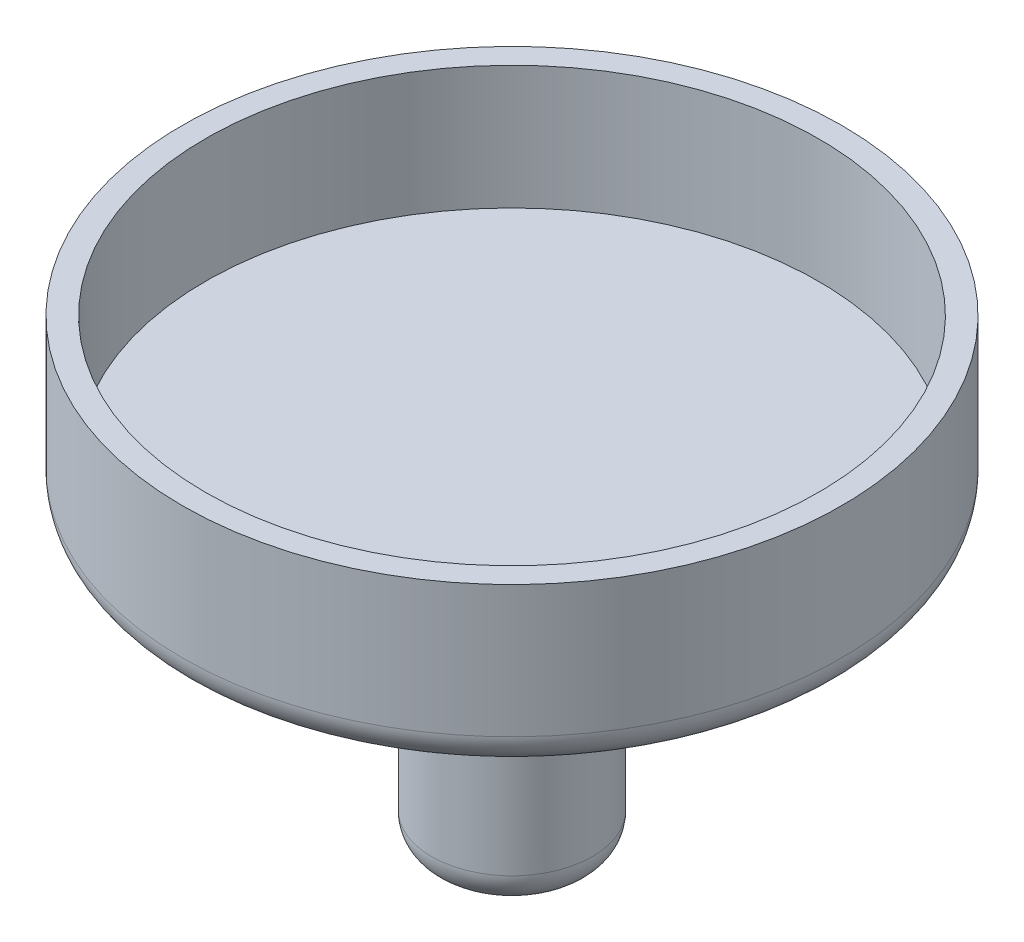
ISO-10303-21;
HEADER;
FILE_DESCRIPTION(('STEP AP214'),'2;1');
FILE_NAME('part.step','',(''),(''),'','','');
FILE_SCHEMA(('AUTOMOTIVE_DESIGN { 1 0 10303 214 1 1 1 1 }'));
ENDSEC;
DATA;
#1=APPLICATION_CONTEXT('core data for automotive mechanical design processes');
#2=APPLICATION_PROTOCOL_DEFINITION('international standard','automotive_design',2000,#1);
#3=PRODUCT_CONTEXT('',#1,'mechanical');
#4=PRODUCT('Part','Part','',(#3));
#5=PRODUCT_RELATED_PRODUCT_CATEGORY('part','',(#4));
#6=PRODUCT_DEFINITION_FORMATION('','',#4);
#7=PRODUCT_DEFINITION_CONTEXT('part definition',#1,'design');
#8=PRODUCT_DEFINITION('design','',#6,#7);
#9=PRODUCT_DEFINITION_SHAPE('','',#8);
#10=(LENGTH_UNIT() NAMED_UNIT(*) SI_UNIT(.MILLI.,.METRE.));
#11=(NAMED_UNIT(*) PLANE_ANGLE_UNIT() SI_UNIT($,.RADIAN.));
#12=(NAMED_UNIT(*) SI_UNIT($,.STERADIAN.) SOLID_ANGLE_UNIT());
#13=UNCERTAINTY_MEASURE_WITH_UNIT(LENGTH_MEASURE(1.E-05),#10,'distance_accuracy_value','');
#14=(GEOMETRIC_REPRESENTATION_CONTEXT(3) GLOBAL_UNCERTAINTY_ASSIGNED_CONTEXT((#13)) GLOBAL_UNIT_ASSIGNED_CONTEXT((#10,
#11,#12)) REPRESENTATION_CONTEXT('',''));
#15=CARTESIAN_POINT('',(0.,0.,0.));
#16=DIRECTION('',(0.,0.,1.));
#17=DIRECTION('',(1.,0.,0.));
#18=AXIS2_PLACEMENT_3D('',#15,#16,#17);
#19=CARTESIAN_POINT('',(0.,6.35,0.));
#20=DIRECTION('',(0.,-1.,0.));
#21=DIRECTION('',(0.,0.,-1.));
#22=AXIS2_PLACEMENT_3D('',#19,#20,#21);
#23=CYLINDRICAL_SURFACE('',#22,12.7);
#24=CARTESIAN_POINT('',(0.,1.27,0.));
#25=DIRECTION('',(0.,1.,0.));
#26=DIRECTION('',(0.,0.,1.));
#27=AXIS2_PLACEMENT_3D('',#24,#25,#26);
#28=CIRCLE('',#27,12.7);
#29=CARTESIAN_POINT('',(0.,1.27,12.7));
#30=VERTEX_POINT('',#29);
#31=EDGE_CURVE('E65',#30,#30,#28,.T.);
#32=ORIENTED_EDGE('',*,*,#31,.T.);
#33=EDGE_LOOP('',(#32));
#34=FACE_BOUND('',#33,.T.);
#35=CARTESIAN_POINT('',(0.,6.35,0.));
#36=DIRECTION('',(0.,1.,0.));
#37=DIRECTION('',(0.,0.,1.));
#38=AXIS2_PLACEMENT_3D('',#35,#36,#37);
#39=CIRCLE('',#38,12.7);
#40=CARTESIAN_POINT('',(0.,6.35,12.7));
#41=VERTEX_POINT('',#40);
#42=EDGE_CURVE('E69',#41,#41,#39,.T.);
#43=ORIENTED_EDGE('',*,*,#42,.F.);
#44=EDGE_LOOP('',(#43));
#45=FACE_BOUND('',#44,.T.);
#46=ADVANCED_FACE('F37',(#34,#45),#23,.T.);
#47=CARTESIAN_POINT('',(0.,6.35,0.));
#48=DIRECTION('',(0.,1.,0.));
#49=DIRECTION('',(0.,0.,1.));
#50=AXIS2_PLACEMENT_3D('',#47,#48,#49);
#51=PLANE('',#50);
#52=CARTESIAN_POINT('',(0.,6.35,0.));
#53=DIRECTION('',(0.,1.,0.));
#54=DIRECTION('',(0.,0.,1.));
#55=AXIS2_PLACEMENT_3D('',#52,#53,#54);
#56=CIRCLE('',#55,11.811);
#57=CARTESIAN_POINT('',(0.,6.35,11.811));
#58=VERTEX_POINT('',#57);
#59=EDGE_CURVE('E74',#58,#58,#56,.T.);
#60=ORIENTED_EDGE('',*,*,#59,.F.);
#61=EDGE_LOOP('',(#60));
#62=FACE_BOUND('',#61,.T.);
#63=ORIENTED_EDGE('',*,*,#42,.T.);
#64=EDGE_LOOP('',(#63));
#65=FACE_BOUND('',#64,.T.);
#66=ADVANCED_FACE('F91',(#62,#65),#51,.T.);
#67=CARTESIAN_POINT('',(0.,0.,0.));
#68=DIRECTION('',(0.,1.,0.));
#69=DIRECTION('',(0.,0.,1.));
#70=AXIS2_PLACEMENT_3D('',#67,#68,#69);
#71=PLANE('',#70);
#72=CARTESIAN_POINT('',(0.,0.,0.));
#73=DIRECTION('',(0.,1.,0.));
#74=DIRECTION('',(0.,0.,1.));
#75=AXIS2_PLACEMENT_3D('',#72,#73,#74);
#76=CIRCLE('',#75,11.43);
#77=CARTESIAN_POINT('',(0.,0.,11.43));
#78=VERTEX_POINT('',#77);
#79=EDGE_CURVE('E55',#78,#78,#76,.F.);
#80=ORIENTED_EDGE('',*,*,#79,.T.);
#81=EDGE_LOOP('',(#80));
#82=FACE_BOUND('',#81,.T.);
#83=CARTESIAN_POINT('',(0.,0.,0.));
#84=DIRECTION('',(0.,1.,0.));
#85=DIRECTION('',(0.,0.,1.));
#86=AXIS2_PLACEMENT_3D('',#83,#84,#85);
#87=CIRCLE('',#86,4.3688);
#88=CARTESIAN_POINT('',(0.,0.,4.3688));
#89=VERTEX_POINT('',#88);
#90=EDGE_CURVE('E61',#89,#89,#87,.T.);
#91=ORIENTED_EDGE('',*,*,#90,.T.);
#92=EDGE_LOOP('',(#91));
#93=FACE_BOUND('',#92,.T.);
#94=ADVANCED_FACE('F87',(#82,#93),#71,.F.);
#95=CARTESIAN_POINT('',(0.,1.5875,0.));
#96=DIRECTION('',(0.,1.,0.));
#97=DIRECTION('',(0.,0.,1.));
#98=AXIS2_PLACEMENT_3D('',#95,#96,#97);
#99=CYLINDRICAL_SURFACE('',#98,11.811);
#100=CARTESIAN_POINT('',(0.,1.5875,0.));
#101=DIRECTION('',(0.,1.,0.));
#102=DIRECTION('',(0.,0.,1.));
#103=AXIS2_PLACEMENT_3D('',#100,#101,#102);
#104=CIRCLE('',#103,11.811);
#105=CARTESIAN_POINT('',(0.,1.5875,11.811));
#106=VERTEX_POINT('',#105);
#107=EDGE_CURVE('E73',#106,#106,#104,.T.);
#108=CARTESIAN_POINT('',(0.,1.5875,11.811));
#109=CARTESIAN_POINT('',(0.,1.637109375,11.811));
#110=CARTESIAN_POINT('',(0.,1.68671875,11.811));
#111=CARTESIAN_POINT('',(0.,1.7859375,11.811));
#112=CARTESIAN_POINT('',(0.,1.835546875,11.811));
#113=CARTESIAN_POINT('',(0.,1.934765625,11.811));
#114=CARTESIAN_POINT('',(0.,1.984375,11.811));
#115=CARTESIAN_POINT('',(0.,2.08359375,11.811));
#116=CARTESIAN_POINT('',(0.,2.133203125,11.811));
#117=CARTESIAN_POINT('',(0.,2.232421875,11.811));
#118=CARTESIAN_POINT('',(0.,2.28203125,11.811));
#119=CARTESIAN_POINT('',(0.,2.38125,11.811));
#120=CARTESIAN_POINT('',(0.,2.430859375,11.811));
#121=CARTESIAN_POINT('',(0.,2.530078125,11.811));
#122=CARTESIAN_POINT('',(0.,2.5796875,11.811));
#123=CARTESIAN_POINT('',(0.,2.67890625,11.811));
#124=CARTESIAN_POINT('',(0.,2.728515625,11.811));
#125=CARTESIAN_POINT('',(0.,2.827734375,11.811));
#126=CARTESIAN_POINT('',(0.,2.87734375,11.811));
#127=CARTESIAN_POINT('',(0.,2.9765625,11.811));
#128=CARTESIAN_POINT('',(0.,3.026171875,11.811));
#129=CARTESIAN_POINT('',(0.,3.125390625,11.811));
#130=CARTESIAN_POINT('',(0.,3.175,11.811));
#131=CARTESIAN_POINT('',(0.,3.27421875,11.811));
#132=CARTESIAN_POINT('',(0.,3.323828125,11.811));
#133=CARTESIAN_POINT('',(0.,3.423046875,11.811));
#134=CARTESIAN_POINT('',(0.,3.47265625,11.811));
#135=CARTESIAN_POINT('',(0.,3.571875,11.811));
#136=CARTESIAN_POINT('',(0.,3.621484375,11.811));
#137=CARTESIAN_POINT('',(0.,3.720703125,11.811));
#138=CARTESIAN_POINT('',(0.,3.7703125,11.811));
#139=CARTESIAN_POINT('',(0.,3.86953125,11.811));
#140=CARTESIAN_POINT('',(0.,3.919140625,11.811));
#141=CARTESIAN_POINT('',(0.,4.018359375,11.811));
#142=CARTESIAN_POINT('',(0.,4.06796875,11.811));
#143=CARTESIAN_POINT('',(0.,4.1671875,11.811));
#144=CARTESIAN_POINT('',(0.,4.216796875,11.811));
#145=CARTESIAN_POINT('',(0.,4.316015625,11.811));
#146=CARTESIAN_POINT('',(0.,4.365625,11.811));
#147=CARTESIAN_POINT('',(0.,4.46484375,11.811));
#148=CARTESIAN_POINT('',(0.,4.514453125,11.811));
#149=CARTESIAN_POINT('',(0.,4.613671875,11.811));
#150=CARTESIAN_POINT('',(0.,4.66328125,11.811));
#151=CARTESIAN_POINT('',(0.,4.7625,11.811));
#152=CARTESIAN_POINT('',(0.,4.812109375,11.811));
#153=CARTESIAN_POINT('',(0.,4.911328125,11.811));
#154=CARTESIAN_POINT('',(0.,4.9609375,11.811));
#155=CARTESIAN_POINT('',(0.,5.06015625,11.811));
#156=CARTESIAN_POINT('',(0.,5.109765625,11.811));
#157=CARTESIAN_POINT('',(0.,5.208984375,11.811));
#158=CARTESIAN_POINT('',(0.,5.25859375,11.811));
#159=CARTESIAN_POINT('',(0.,5.3578125,11.811));
#160=CARTESIAN_POINT('',(0.,5.407421875,11.811));
#161=CARTESIAN_POINT('',(0.,5.506640625,11.811));
#162=CARTESIAN_POINT('',(0.,5.55625,11.811));
#163=CARTESIAN_POINT('',(0.,5.65546875,11.811));
#164=CARTESIAN_POINT('',(0.,5.705078125,11.811));
#165=CARTESIAN_POINT('',(0.,5.804296875,11.811));
#166=CARTESIAN_POINT('',(0.,5.85390625,11.811));
#167=CARTESIAN_POINT('',(0.,5.953125,11.811));
#168=CARTESIAN_POINT('',(0.,6.002734375,11.811));
#169=CARTESIAN_POINT('',(0.,6.101953125,11.811));
#170=CARTESIAN_POINT('',(0.,6.1515625,11.811));
#171=CARTESIAN_POINT('',(0.,6.25078125,11.811));
#172=CARTESIAN_POINT('',(0.,6.300390625,11.811));
#173=CARTESIAN_POINT('',(0.,6.35,11.811));
#174=B_SPLINE_CURVE_WITH_KNOTS('',3,(#108,#109,#110,#111,#112,#113,#114,#115,#116,#117,#118,
#119,#120,#121,#122,#123,#124,#125,#126,#127,#128,#129,#130,#131,#132,#133,#134,#135,#136,#137,
#138,#139,#140,#141,#142,#143,#144,#145,#146,#147,#148,#149,#150,#151,#152,#153,#154,#155,#156,
#157,#158,#159,#160,#161,#162,#163,#164,#165,#166,#167,#168,#169,#170,#171,#172,#173),
.UNSPECIFIED.,.F.,.F.,(4,2,2,2,2,2,2,2,2,2,2,2,2,2,2,2,2,2,2,2,2,2,2,2,2,2,2,2,2,2,2,2,4),(0.,
0.148828125,0.29765625,0.446484375,0.5953125,0.744140625,0.89296875,1.041796875,1.190625,
1.339453125,1.48828125,1.637109375,1.7859375,1.934765625,2.08359375,2.232421875,2.38125,
2.530078125,2.67890625,2.827734375,2.9765625,3.125390625,3.27421875,3.423046875,3.571875,
3.720703125,3.86953125,4.018359375,4.1671875,4.316015625,4.46484375,4.613671875,4.7625),.UNSPECIFIED.);
#175=EDGE_CURVE('BSEAM84',#106,#58,#174,.T.);
#176=ORIENTED_EDGE('',*,*,#107,.F.);
#177=ORIENTED_EDGE('',*,*,#59,.T.);
#178=ORIENTED_EDGE('',*,*,#175,.T.);
#179=ORIENTED_EDGE('',*,*,#175,.F.);
#180=EDGE_LOOP('',(#176,#178,#177,#179));
#181=FACE_BOUND('',#180,.T.);
#182=ADVANCED_FACE('F84',(#181),#99,.F.);
#183=CARTESIAN_POINT('',(0.,1.5875,0.));
#184=DIRECTION('',(0.,1.,0.));
#185=DIRECTION('',(0.,0.,1.));
#186=AXIS2_PLACEMENT_3D('',#183,#184,#185);
#187=PLANE('',#186);
#188=ORIENTED_EDGE('',*,*,#107,.T.);
#189=EDGE_LOOP('',(#188));
#190=FACE_BOUND('',#189,.T.);
#191=ADVANCED_FACE('F82',(#190),#187,.T.);
#192=CARTESIAN_POINT('',(0.,-11.43,0.));
#193=DIRECTION('',(0.,1.,0.));
#194=DIRECTION('',(0.,0.,1.));
#195=AXIS2_PLACEMENT_3D('',#192,#193,#194);
#196=CYLINDRICAL_SURFACE('',#195,3.0988);
#197=CARTESIAN_POINT('',(0.,-1.27,0.));
#198=DIRECTION('',(0.,1.,0.));
#199=DIRECTION('',(0.,0.,1.));
#200=AXIS2_PLACEMENT_3D('',#197,#198,#199);
#201=CIRCLE('',#200,3.0988);
#202=CARTESIAN_POINT('',(0.,-1.27,3.0988));
#203=VERTEX_POINT('',#202);
#204=EDGE_CURVE('E45',#203,#203,#201,.F.);
#205=ORIENTED_EDGE('',*,*,#204,.T.);
#206=EDGE_LOOP('',(#205));
#207=FACE_BOUND('',#206,.T.);
#208=CARTESIAN_POINT('',(0.,-10.16,0.));
#209=DIRECTION('',(0.,-1.,0.));
#210=DIRECTION('',(0.,0.,-1.));
#211=AXIS2_PLACEMENT_3D('',#208,#209,#210);
#212=CIRCLE('',#211,3.0988);
#213=CARTESIAN_POINT('',(0.,-10.16,-3.0988));
#214=VERTEX_POINT('',#213);
#215=EDGE_CURVE('E50',#214,#214,#212,.F.);
#216=ORIENTED_EDGE('',*,*,#215,.T.);
#217=EDGE_LOOP('',(#216));
#218=FACE_BOUND('',#217,.T.);
#219=ADVANCED_FACE('F138',(#207,#218),#196,.T.);
#220=CARTESIAN_POINT('',(0.,-11.43,0.));
#221=DIRECTION('',(0.,-1.,0.));
#222=DIRECTION('',(0.,0.,-1.));
#223=AXIS2_PLACEMENT_3D('',#220,#221,#222);
#224=PLANE('',#223);
#225=CARTESIAN_POINT('',(0.,-11.43,0.));
#226=DIRECTION('',(0.,-1.,0.));
#227=DIRECTION('',(0.,0.,-1.));
#228=AXIS2_PLACEMENT_3D('',#225,#226,#227);
#229=CIRCLE('',#228,1.8288);
#230=CARTESIAN_POINT('',(0.,-11.43,-1.8288));
#231=VERTEX_POINT('',#230);
#232=EDGE_CURVE('E10',#231,#231,#229,.T.);
#233=ORIENTED_EDGE('',*,*,#232,.T.);
#234=EDGE_LOOP('',(#233));
#235=FACE_BOUND('',#234,.T.);
#236=ADVANCED_FACE('F107',(#235),#224,.T.);
#237=CARTESIAN_POINT('',(0.,1.27,0.));
#238=DIRECTION('',(0.,1.,0.));
#239=DIRECTION('',(0.,0.,1.));
#240=AXIS2_PLACEMENT_3D('',#237,#238,#239);
#241=TOROIDAL_SURFACE('',#240,11.43,1.27);
#242=ORIENTED_EDGE('',*,*,#79,.F.);
#243=EDGE_LOOP('',(#242));
#244=FACE_BOUND('',#243,.T.);
#245=ORIENTED_EDGE('',*,*,#31,.F.);
#246=EDGE_LOOP('',(#245));
#247=FACE_BOUND('',#246,.T.);
#248=ADVANCED_FACE('F104',(#244,#247),#241,.T.);
#249=CARTESIAN_POINT('',(0.,-1.27,0.));
#250=DIRECTION('',(0.,1.,0.));
#251=DIRECTION('',(0.,0.,1.));
#252=AXIS2_PLACEMENT_3D('',#249,#250,#251);
#253=TOROIDAL_SURFACE('',#252,4.3688,1.27);
#254=ORIENTED_EDGE('',*,*,#90,.F.);
#255=EDGE_LOOP('',(#254));
#256=FACE_BOUND('',#255,.T.);
#257=ORIENTED_EDGE('',*,*,#204,.F.);
#258=EDGE_LOOP('',(#257));
#259=FACE_BOUND('',#258,.T.);
#260=ADVANCED_FACE('F106',(#256,#259),#253,.F.);
#261=CARTESIAN_POINT('',(0.,-10.16,0.));
#262=DIRECTION('',(0.,-1.,0.));
#263=DIRECTION('',(0.,0.,-1.));
#264=AXIS2_PLACEMENT_3D('',#261,#262,#263);
#265=TOROIDAL_SURFACE('',#264,1.8288,1.27);
#266=ORIENTED_EDGE('',*,*,#215,.F.);
#267=EDGE_LOOP('',(#266));
#268=FACE_BOUND('',#267,.T.);
#269=ORIENTED_EDGE('',*,*,#232,.F.);
#270=EDGE_LOOP('',(#269));
#271=FACE_BOUND('',#270,.T.);
#272=ADVANCED_FACE('F39',(#268,#271),#265,.T.);
#273=CLOSED_SHELL('',(#46,#66,#94,#182,#191,#219,#236,#248,#260,#272));
#274=MANIFOLD_SOLID_BREP('B2',#273);
#275=ADVANCED_BREP_SHAPE_REPRESENTATION('',(#18,#274),#14);
#276=SHAPE_DEFINITION_REPRESENTATION(#9,#275);
ENDSEC;
END-ISO-10303-21;
